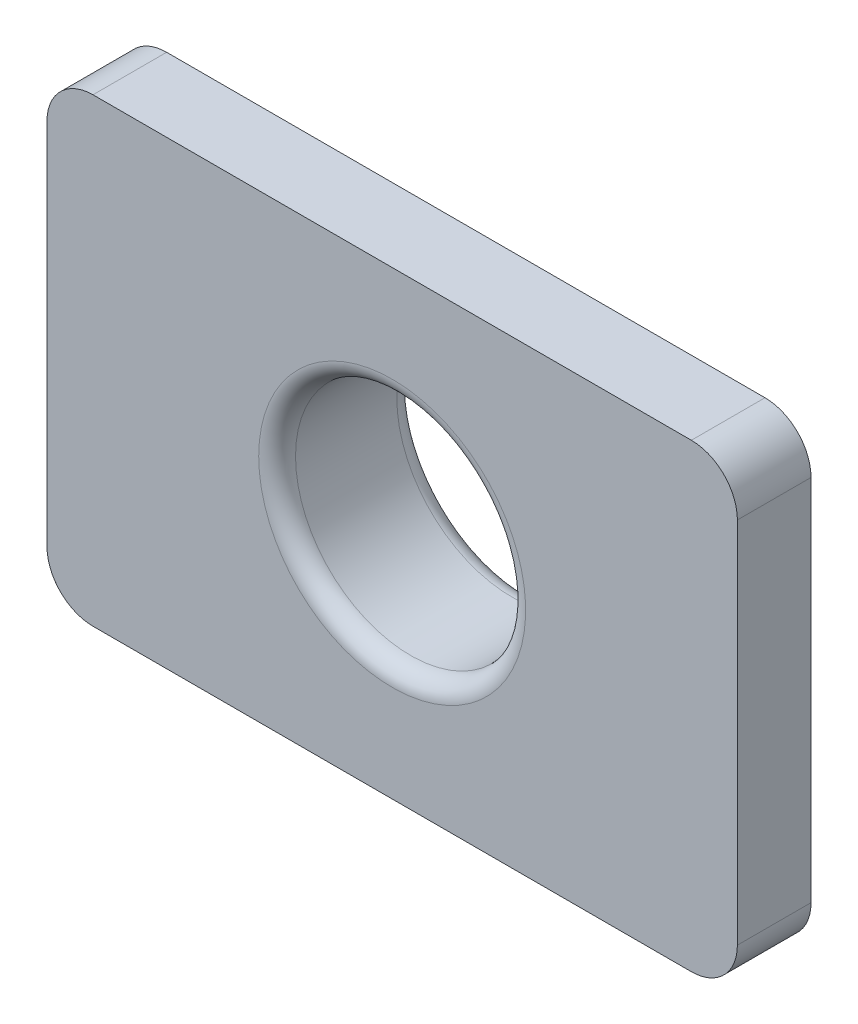
ISO-10303-21;
HEADER;
FILE_DESCRIPTION(('STEP AP214'),'2;1');
FILE_NAME('part.step','',(''),(''),'','','');
FILE_SCHEMA(('AUTOMOTIVE_DESIGN { 1 0 10303 214 1 1 1 1 }'));
ENDSEC;
DATA;
#1=APPLICATION_CONTEXT('core data for automotive mechanical design processes');
#2=APPLICATION_PROTOCOL_DEFINITION('international standard','automotive_design',2000,#1);
#3=PRODUCT_CONTEXT('',#1,'mechanical');
#4=PRODUCT('Part','Part','',(#3));
#5=PRODUCT_RELATED_PRODUCT_CATEGORY('part','',(#4));
#6=PRODUCT_DEFINITION_FORMATION('','',#4);
#7=PRODUCT_DEFINITION_CONTEXT('part definition',#1,'design');
#8=PRODUCT_DEFINITION('design','',#6,#7);
#9=PRODUCT_DEFINITION_SHAPE('','',#8);
#10=(LENGTH_UNIT() NAMED_UNIT(*) SI_UNIT(.MILLI.,.METRE.));
#11=(NAMED_UNIT(*) PLANE_ANGLE_UNIT() SI_UNIT($,.RADIAN.));
#12=(NAMED_UNIT(*) SI_UNIT($,.STERADIAN.) SOLID_ANGLE_UNIT());
#13=UNCERTAINTY_MEASURE_WITH_UNIT(LENGTH_MEASURE(1.E-05),#10,'distance_accuracy_value','');
#14=(GEOMETRIC_REPRESENTATION_CONTEXT(3) GLOBAL_UNCERTAINTY_ASSIGNED_CONTEXT((#13)) GLOBAL_UNIT_ASSIGNED_CONTEXT((#10,
#11,#12)) REPRESENTATION_CONTEXT('',''));
#15=CARTESIAN_POINT('',(0.,0.,0.));
#16=DIRECTION('',(0.,0.,1.));
#17=DIRECTION('',(1.,0.,0.));
#18=AXIS2_PLACEMENT_3D('',#15,#16,#17);
#19=CARTESIAN_POINT('',(0.,0.,0.));
#20=DIRECTION('',(0.,0.,-1.));
#21=DIRECTION('',(-1.,0.,0.));
#22=AXIS2_PLACEMENT_3D('',#19,#20,#21);
#23=PLANE('',#22);
#24=CARTESIAN_POINT('',(7.5,5.,0.));
#25=DIRECTION('',(0.,0.,-1.));
#26=DIRECTION('',(-1.,0.,0.));
#27=AXIS2_PLACEMENT_3D('',#24,#25,#26);
#28=CIRCLE('',#27,3.9);
#29=CARTESIAN_POINT('',(3.6,5.,0.));
#30=VERTEX_POINT('',#29);
#31=EDGE_CURVE('E179',#30,#30,#28,.F.);
#32=ORIENTED_EDGE('',*,*,#31,.T.);
#33=EDGE_LOOP('',(#32));
#34=FACE_BOUND('',#33,.T.);
#35=DIRECTION('',(-1.,0.,0.));
#36=VECTOR('',#35,1.);
#37=CARTESIAN_POINT('',(0.,10.,0.));
#38=LINE('',#37,#36);
#39=CARTESIAN_POINT('',(14.,10.,0.));
#40=VERTEX_POINT('',#39);
#41=CARTESIAN_POINT('',(1.,10.,0.));
#42=VERTEX_POINT('',#41);
#43=EDGE_CURVE('E137',#40,#42,#38,.T.);
#44=ORIENTED_EDGE('',*,*,#43,.F.);
#45=CARTESIAN_POINT('',(14.,9.,0.));
#46=DIRECTION('',(0.,0.,-1.));
#47=DIRECTION('',(-1.,0.,0.));
#48=AXIS2_PLACEMENT_3D('',#45,#46,#47);
#49=CIRCLE('',#48,1.);
#50=CARTESIAN_POINT('',(15.,9.,0.));
#51=VERTEX_POINT('',#50);
#52=EDGE_CURVE('E119',#40,#51,#49,.T.);
#53=ORIENTED_EDGE('',*,*,#52,.T.);
#54=DIRECTION('',(0.,1.,0.));
#55=VECTOR('',#54,1.);
#56=CARTESIAN_POINT('',(15.,0.,0.));
#57=LINE('',#56,#55);
#58=CARTESIAN_POINT('',(15.,1.,0.));
#59=VERTEX_POINT('',#58);
#60=EDGE_CURVE('E149',#59,#51,#57,.T.);
#61=ORIENTED_EDGE('',*,*,#60,.F.);
#62=CARTESIAN_POINT('',(14.,1.,0.));
#63=DIRECTION('',(0.,0.,-1.));
#64=DIRECTION('',(-1.,0.,0.));
#65=AXIS2_PLACEMENT_3D('',#62,#63,#64);
#66=CIRCLE('',#65,1.);
#67=CARTESIAN_POINT('',(14.,0.,0.));
#68=VERTEX_POINT('',#67);
#69=EDGE_CURVE('E131',#59,#68,#66,.T.);
#70=ORIENTED_EDGE('',*,*,#69,.T.);
#71=DIRECTION('',(1.,0.,0.));
#72=VECTOR('',#71,1.);
#73=CARTESIAN_POINT('',(0.,0.,0.));
#74=LINE('',#73,#72);
#75=CARTESIAN_POINT('',(1.,0.,0.));
#76=VERTEX_POINT('',#75);
#77=EDGE_CURVE('E155',#76,#68,#74,.T.);
#78=ORIENTED_EDGE('',*,*,#77,.F.);
#79=CARTESIAN_POINT('',(1.,1.,0.));
#80=DIRECTION('',(0.,0.,-1.));
#81=DIRECTION('',(-1.,0.,0.));
#82=AXIS2_PLACEMENT_3D('',#79,#80,#81);
#83=CIRCLE('',#82,1.);
#84=CARTESIAN_POINT('',(0.,1.,0.));
#85=VERTEX_POINT('',#84);
#86=EDGE_CURVE('E142',#76,#85,#83,.T.);
#87=ORIENTED_EDGE('',*,*,#86,.T.);
#88=DIRECTION('',(0.,-1.,0.));
#89=VECTOR('',#88,1.);
#90=CARTESIAN_POINT('',(0.,0.,0.));
#91=LINE('',#90,#89);
#92=CARTESIAN_POINT('',(0.,9.,0.));
#93=VERTEX_POINT('',#92);
#94=EDGE_CURVE('E226',#93,#85,#91,.T.);
#95=ORIENTED_EDGE('',*,*,#94,.F.);
#96=CARTESIAN_POINT('',(1.,9.,0.));
#97=DIRECTION('',(0.,0.,-1.));
#98=DIRECTION('',(-1.,0.,0.));
#99=AXIS2_PLACEMENT_3D('',#96,#97,#98);
#100=CIRCLE('',#99,1.);
#101=EDGE_CURVE('E146',#93,#42,#100,.T.);
#102=ORIENTED_EDGE('',*,*,#101,.T.);
#103=EDGE_LOOP('',(#44,#53,#61,#70,#78,#87,#95,#102));
#104=FACE_BOUND('',#103,.T.);
#105=ADVANCED_FACE('F38',(#34,#104),#23,.T.);
#106=CARTESIAN_POINT('',(0.,0.,1.6));
#107=DIRECTION('',(0.,0.,-1.));
#108=DIRECTION('',(-1.,0.,0.));
#109=AXIS2_PLACEMENT_3D('',#106,#107,#108);
#110=PLANE('',#109);
#111=CARTESIAN_POINT('',(7.5,5.,1.6));
#112=DIRECTION('',(0.,0.,-1.));
#113=DIRECTION('',(-1.,0.,0.));
#114=AXIS2_PLACEMENT_3D('',#111,#112,#113);
#115=CIRCLE('',#114,2.9);
#116=CARTESIAN_POINT('',(4.6,5.,1.6));
#117=VERTEX_POINT('',#116);
#118=EDGE_CURVE('E167',#117,#117,#115,.T.);
#119=ORIENTED_EDGE('',*,*,#118,.T.);
#120=EDGE_LOOP('',(#119));
#121=FACE_BOUND('',#120,.T.);
#122=DIRECTION('',(0.,1.,0.));
#123=VECTOR('',#122,1.);
#124=CARTESIAN_POINT('',(15.,0.,1.6));
#125=LINE('',#124,#123);
#126=CARTESIAN_POINT('',(15.,1.,1.6));
#127=VERTEX_POINT('',#126);
#128=CARTESIAN_POINT('',(15.,9.,1.6));
#129=VERTEX_POINT('',#128);
#130=EDGE_CURVE('E239',#127,#129,#125,.T.);
#131=ORIENTED_EDGE('',*,*,#130,.T.);
#132=CARTESIAN_POINT('',(14.,9.,1.6));
#133=DIRECTION('',(0.,0.,-1.));
#134=DIRECTION('',(-1.,0.,0.));
#135=AXIS2_PLACEMENT_3D('',#132,#133,#134);
#136=CIRCLE('',#135,1.);
#137=CARTESIAN_POINT('',(14.,10.,1.6));
#138=VERTEX_POINT('',#137);
#139=EDGE_CURVE('E210',#129,#138,#136,.F.);
#140=ORIENTED_EDGE('',*,*,#139,.T.);
#141=DIRECTION('',(-1.,0.,0.));
#142=VECTOR('',#141,1.);
#143=CARTESIAN_POINT('',(0.,10.,1.6));
#144=LINE('',#143,#142);
#145=CARTESIAN_POINT('',(1.,10.,1.6));
#146=VERTEX_POINT('',#145);
#147=EDGE_CURVE('E140',#138,#146,#144,.T.);
#148=ORIENTED_EDGE('',*,*,#147,.T.);
#149=CARTESIAN_POINT('',(1.,9.,1.6));
#150=DIRECTION('',(0.,0.,-1.));
#151=DIRECTION('',(-1.,0.,0.));
#152=AXIS2_PLACEMENT_3D('',#149,#150,#151);
#153=CIRCLE('',#152,1.);
#154=CARTESIAN_POINT('',(0.,9.,1.6));
#155=VERTEX_POINT('',#154);
#156=EDGE_CURVE('E204',#146,#155,#153,.F.);
#157=ORIENTED_EDGE('',*,*,#156,.T.);
#158=DIRECTION('',(0.,-1.,0.));
#159=VECTOR('',#158,1.);
#160=CARTESIAN_POINT('',(0.,0.,1.6));
#161=LINE('',#160,#159);
#162=CARTESIAN_POINT('',(0.,1.,1.6));
#163=VERTEX_POINT('',#162);
#164=EDGE_CURVE('E148',#155,#163,#161,.T.);
#165=ORIENTED_EDGE('',*,*,#164,.T.);
#166=CARTESIAN_POINT('',(1.,1.,1.6));
#167=DIRECTION('',(0.,0.,-1.));
#168=DIRECTION('',(-1.,0.,0.));
#169=AXIS2_PLACEMENT_3D('',#166,#167,#168);
#170=CIRCLE('',#169,1.);
#171=CARTESIAN_POINT('',(1.,0.,1.6));
#172=VERTEX_POINT('',#171);
#173=EDGE_CURVE('E64',#163,#172,#170,.F.);
#174=ORIENTED_EDGE('',*,*,#173,.T.);
#175=DIRECTION('',(1.,0.,0.));
#176=VECTOR('',#175,1.);
#177=CARTESIAN_POINT('',(0.,0.,1.6));
#178=LINE('',#177,#176);
#179=CARTESIAN_POINT('',(14.,0.,1.6));
#180=VERTEX_POINT('',#179);
#181=EDGE_CURVE('E152',#172,#180,#178,.T.);
#182=ORIENTED_EDGE('',*,*,#181,.T.);
#183=CARTESIAN_POINT('',(14.,1.,1.6));
#184=DIRECTION('',(0.,0.,-1.));
#185=DIRECTION('',(-1.,0.,0.));
#186=AXIS2_PLACEMENT_3D('',#183,#184,#185);
#187=CIRCLE('',#186,1.);
#188=EDGE_CURVE('E207',#180,#127,#187,.F.);
#189=ORIENTED_EDGE('',*,*,#188,.T.);
#190=EDGE_LOOP('',(#131,#140,#148,#157,#165,#174,#182,#189));
#191=FACE_BOUND('',#190,.T.);
#192=ADVANCED_FACE('F229',(#121,#191),#110,.F.);
#193=CARTESIAN_POINT('',(0.,0.,1.6));
#194=DIRECTION('',(1.,0.,0.));
#195=DIRECTION('',(0.,0.,-1.));
#196=AXIS2_PLACEMENT_3D('',#193,#194,#195);
#197=PLANE('',#196);
#198=ORIENTED_EDGE('',*,*,#164,.F.);
#199=DIRECTION('',(0.,0.,-1.));
#200=VECTOR('',#199,1.);
#201=CARTESIAN_POINT('',(0.,9.,1.6));
#202=LINE('',#201,#200);
#203=EDGE_CURVE('E11',#155,#93,#202,.T.);
#204=ORIENTED_EDGE('',*,*,#203,.T.);
#205=ORIENTED_EDGE('',*,*,#94,.T.);
#206=DIRECTION('',(0.,0.,-1.));
#207=VECTOR('',#206,1.);
#208=CARTESIAN_POINT('',(0.,1.,1.6));
#209=LINE('',#208,#207);
#210=EDGE_CURVE('E46',#85,#163,#209,.F.);
#211=ORIENTED_EDGE('',*,*,#210,.T.);
#212=EDGE_LOOP('',(#198,#204,#205,#211));
#213=FACE_BOUND('',#212,.T.);
#214=ADVANCED_FACE('F224',(#213),#197,.F.);
#215=CARTESIAN_POINT('',(0.,0.,1.6));
#216=DIRECTION('',(0.,1.,0.));
#217=DIRECTION('',(0.,0.,1.));
#218=AXIS2_PLACEMENT_3D('',#215,#216,#217);
#219=PLANE('',#218);
#220=ORIENTED_EDGE('',*,*,#77,.T.);
#221=DIRECTION('',(0.,0.,-1.));
#222=VECTOR('',#221,1.);
#223=CARTESIAN_POINT('',(14.,0.,1.6));
#224=LINE('',#223,#222);
#225=EDGE_CURVE('E55',#68,#180,#224,.F.);
#226=ORIENTED_EDGE('',*,*,#225,.T.);
#227=ORIENTED_EDGE('',*,*,#181,.F.);
#228=DIRECTION('',(0.,0.,-1.));
#229=VECTOR('',#228,1.);
#230=CARTESIAN_POINT('',(1.,0.,1.6));
#231=LINE('',#230,#229);
#232=EDGE_CURVE('E213',#172,#76,#231,.T.);
#233=ORIENTED_EDGE('',*,*,#232,.T.);
#234=EDGE_LOOP('',(#220,#226,#227,#233));
#235=FACE_BOUND('',#234,.T.);
#236=ADVANCED_FACE('F233',(#235),#219,.F.);
#237=CARTESIAN_POINT('',(15.,0.,1.6));
#238=DIRECTION('',(-1.,0.,0.));
#239=DIRECTION('',(0.,0.,1.));
#240=AXIS2_PLACEMENT_3D('',#237,#238,#239);
#241=PLANE('',#240);
#242=ORIENTED_EDGE('',*,*,#60,.T.);
#243=DIRECTION('',(0.,0.,-1.));
#244=VECTOR('',#243,1.);
#245=CARTESIAN_POINT('',(15.,9.,1.6));
#246=LINE('',#245,#244);
#247=EDGE_CURVE('E124',#51,#129,#246,.F.);
#248=ORIENTED_EDGE('',*,*,#247,.T.);
#249=ORIENTED_EDGE('',*,*,#130,.F.);
#250=DIRECTION('',(0.,0.,-1.));
#251=VECTOR('',#250,1.);
#252=CARTESIAN_POINT('',(15.,1.,1.6));
#253=LINE('',#252,#251);
#254=EDGE_CURVE('E130',#127,#59,#253,.T.);
#255=ORIENTED_EDGE('',*,*,#254,.T.);
#256=EDGE_LOOP('',(#242,#248,#249,#255));
#257=FACE_BOUND('',#256,.T.);
#258=ADVANCED_FACE('F249',(#257),#241,.F.);
#259=CARTESIAN_POINT('',(0.,10.,1.6));
#260=DIRECTION('',(0.,-1.,0.));
#261=DIRECTION('',(0.,0.,-1.));
#262=AXIS2_PLACEMENT_3D('',#259,#260,#261);
#263=PLANE('',#262);
#264=ORIENTED_EDGE('',*,*,#147,.F.);
#265=DIRECTION('',(0.,0.,-1.));
#266=VECTOR('',#265,1.);
#267=CARTESIAN_POINT('',(14.,10.,1.6));
#268=LINE('',#267,#266);
#269=EDGE_CURVE('E123',#138,#40,#268,.T.);
#270=ORIENTED_EDGE('',*,*,#269,.T.);
#271=ORIENTED_EDGE('',*,*,#43,.T.);
#272=DIRECTION('',(0.,0.,-1.));
#273=VECTOR('',#272,1.);
#274=CARTESIAN_POINT('',(1.,10.,1.6));
#275=LINE('',#274,#273);
#276=EDGE_CURVE('E143',#42,#146,#275,.F.);
#277=ORIENTED_EDGE('',*,*,#276,.T.);
#278=EDGE_LOOP('',(#264,#270,#271,#277));
#279=FACE_BOUND('',#278,.T.);
#280=ADVANCED_FACE('F136',(#279),#263,.F.);
#281=CARTESIAN_POINT('',(7.5,5.,1.6));
#282=DIRECTION('',(0.,0.,-1.));
#283=DIRECTION('',(-1.,0.,0.));
#284=AXIS2_PLACEMENT_3D('',#281,#282,#283);
#285=CYLINDRICAL_SURFACE('',#284,2.5);
#286=CARTESIAN_POINT('',(7.5,5.,1.2));
#287=DIRECTION('',(0.,0.,-1.));
#288=DIRECTION('',(-1.,0.,0.));
#289=AXIS2_PLACEMENT_3D('',#286,#287,#288);
#290=CIRCLE('',#289,2.5);
#291=CARTESIAN_POINT('',(5.,5.,1.2));
#292=VERTEX_POINT('',#291);
#293=EDGE_CURVE('E163',#292,#292,#290,.F.);
#294=ORIENTED_EDGE('',*,*,#293,.T.);
#295=EDGE_LOOP('',(#294));
#296=FACE_BOUND('',#295,.T.);
#297=CARTESIAN_POINT('',(7.5,5.,-1.));
#298=DIRECTION('',(0.,0.,-1.));
#299=DIRECTION('',(-1.,0.,0.));
#300=AXIS2_PLACEMENT_3D('',#297,#298,#299);
#301=CIRCLE('',#300,2.5);
#302=CARTESIAN_POINT('',(5.,5.,-1.));
#303=VERTEX_POINT('',#302);
#304=EDGE_CURVE('E159',#303,#303,#301,.T.);
#305=ORIENTED_EDGE('',*,*,#304,.T.);
#306=EDGE_LOOP('',(#305));
#307=FACE_BOUND('',#306,.T.);
#308=ADVANCED_FACE('F270',(#296,#307),#285,.F.);
#309=CARTESIAN_POINT('',(7.5,5.,-1.4));
#310=DIRECTION('',(0.,0.,-1.));
#311=DIRECTION('',(-1.,0.,0.));
#312=AXIS2_PLACEMENT_3D('',#309,#310,#311);
#313=PLANE('',#312);
#314=CARTESIAN_POINT('',(7.5,5.,-1.4));
#315=DIRECTION('',(0.,0.,-1.));
#316=DIRECTION('',(-1.,0.,0.));
#317=AXIS2_PLACEMENT_3D('',#314,#315,#316);
#318=CIRCLE('',#317,3.1);
#319=CARTESIAN_POINT('',(4.4,5.,-1.4));
#320=VERTEX_POINT('',#319);
#321=EDGE_CURVE('E187',#320,#320,#318,.T.);
#322=ORIENTED_EDGE('',*,*,#321,.T.);
#323=EDGE_LOOP('',(#322));
#324=FACE_BOUND('',#323,.T.);
#325=CARTESIAN_POINT('',(7.5,5.,-1.4));
#326=DIRECTION('',(0.,0.,-1.));
#327=DIRECTION('',(-1.,0.,0.));
#328=AXIS2_PLACEMENT_3D('',#325,#326,#327);
#329=CIRCLE('',#328,2.9);
#330=CARTESIAN_POINT('',(4.6,5.,-1.4));
#331=VERTEX_POINT('',#330);
#332=EDGE_CURVE('E183',#331,#331,#329,.F.);
#333=ORIENTED_EDGE('',*,*,#332,.T.);
#334=EDGE_LOOP('',(#333));
#335=FACE_BOUND('',#334,.T.);
#336=ADVANCED_FACE('F345',(#324,#335),#313,.T.);
#337=CARTESIAN_POINT('',(7.5,5.,-1.4));
#338=DIRECTION('',(0.,0.,1.));
#339=DIRECTION('',(1.,0.,0.));
#340=AXIS2_PLACEMENT_3D('',#337,#338,#339);
#341=CYLINDRICAL_SURFACE('',#340,3.5);
#342=CARTESIAN_POINT('',(7.5,5.,-0.4));
#343=DIRECTION('',(0.,0.,-1.));
#344=DIRECTION('',(-1.,0.,0.));
#345=AXIS2_PLACEMENT_3D('',#342,#343,#344);
#346=CIRCLE('',#345,3.5);
#347=CARTESIAN_POINT('',(4.,5.,-0.4));
#348=VERTEX_POINT('',#347);
#349=EDGE_CURVE('E175',#348,#348,#346,.T.);
#350=ORIENTED_EDGE('',*,*,#349,.T.);
#351=EDGE_LOOP('',(#350));
#352=FACE_BOUND('',#351,.T.);
#353=CARTESIAN_POINT('',(7.5,5.,-1.));
#354=DIRECTION('',(0.,0.,-1.));
#355=DIRECTION('',(-1.,0.,0.));
#356=AXIS2_PLACEMENT_3D('',#353,#354,#355);
#357=CIRCLE('',#356,3.5);
#358=CARTESIAN_POINT('',(4.,5.,-1.));
#359=VERTEX_POINT('',#358);
#360=EDGE_CURVE('E171',#359,#359,#357,.F.);
#361=ORIENTED_EDGE('',*,*,#360,.T.);
#362=EDGE_LOOP('',(#361));
#363=FACE_BOUND('',#362,.T.);
#364=ADVANCED_FACE('F281',(#352,#363),#341,.T.);
#365=CARTESIAN_POINT('',(7.5,5.,1.2));
#366=DIRECTION('',(0.,0.,-1.));
#367=DIRECTION('',(-1.,0.,0.));
#368=AXIS2_PLACEMENT_3D('',#365,#366,#367);
#369=TOROIDAL_SURFACE('',#368,2.9,0.4);
#370=ORIENTED_EDGE('',*,*,#118,.F.);
#371=EDGE_LOOP('',(#370));
#372=FACE_BOUND('',#371,.T.);
#373=ORIENTED_EDGE('',*,*,#293,.F.);
#374=EDGE_LOOP('',(#373));
#375=FACE_BOUND('',#374,.T.);
#376=ADVANCED_FACE('F277',(#372,#375),#369,.T.);
#377=CARTESIAN_POINT('',(7.5,5.,-0.4));
#378=DIRECTION('',(0.,0.,-1.));
#379=DIRECTION('',(-1.,0.,0.));
#380=AXIS2_PLACEMENT_3D('',#377,#378,#379);
#381=TOROIDAL_SURFACE('',#380,3.9,0.4);
#382=ORIENTED_EDGE('',*,*,#31,.F.);
#383=EDGE_LOOP('',(#382));
#384=FACE_BOUND('',#383,.T.);
#385=ORIENTED_EDGE('',*,*,#349,.F.);
#386=EDGE_LOOP('',(#385));
#387=FACE_BOUND('',#386,.T.);
#388=ADVANCED_FACE('F280',(#384,#387),#381,.F.);
#389=CARTESIAN_POINT('',(7.5,5.,-1.));
#390=DIRECTION('',(0.,0.,-1.));
#391=DIRECTION('',(-1.,0.,0.));
#392=AXIS2_PLACEMENT_3D('',#389,#390,#391);
#393=TOROIDAL_SURFACE('',#392,3.1,0.4);
#394=ORIENTED_EDGE('',*,*,#360,.F.);
#395=EDGE_LOOP('',(#394));
#396=FACE_BOUND('',#395,.T.);
#397=ORIENTED_EDGE('',*,*,#321,.F.);
#398=EDGE_LOOP('',(#397));
#399=FACE_BOUND('',#398,.T.);
#400=ADVANCED_FACE('F285',(#396,#399),#393,.T.);
#401=CARTESIAN_POINT('',(7.5,5.,-1.));
#402=DIRECTION('',(0.,0.,-1.));
#403=DIRECTION('',(-1.,0.,0.));
#404=AXIS2_PLACEMENT_3D('',#401,#402,#403);
#405=TOROIDAL_SURFACE('',#404,2.9,0.4);
#406=ORIENTED_EDGE('',*,*,#332,.F.);
#407=EDGE_LOOP('',(#406));
#408=FACE_BOUND('',#407,.T.);
#409=ORIENTED_EDGE('',*,*,#304,.F.);
#410=EDGE_LOOP('',(#409));
#411=FACE_BOUND('',#410,.T.);
#412=ADVANCED_FACE('F289',(#408,#411),#405,.T.);
#413=CARTESIAN_POINT('',(14.,9.,1.6));
#414=DIRECTION('',(0.,0.,-1.));
#415=DIRECTION('',(-1.,0.,0.));
#416=AXIS2_PLACEMENT_3D('',#413,#414,#415);
#417=CYLINDRICAL_SURFACE('',#416,1.);
#418=ORIENTED_EDGE('',*,*,#139,.F.);
#419=ORIENTED_EDGE('',*,*,#247,.F.);
#420=ORIENTED_EDGE('',*,*,#52,.F.);
#421=ORIENTED_EDGE('',*,*,#269,.F.);
#422=EDGE_LOOP('',(#418,#419,#420,#421));
#423=FACE_BOUND('',#422,.T.);
#424=ADVANCED_FACE('F122',(#423),#417,.T.);
#425=CARTESIAN_POINT('',(14.,1.,1.6));
#426=DIRECTION('',(0.,0.,-1.));
#427=DIRECTION('',(-1.,0.,0.));
#428=AXIS2_PLACEMENT_3D('',#425,#426,#427);
#429=CYLINDRICAL_SURFACE('',#428,1.);
#430=ORIENTED_EDGE('',*,*,#188,.F.);
#431=ORIENTED_EDGE('',*,*,#225,.F.);
#432=ORIENTED_EDGE('',*,*,#69,.F.);
#433=ORIENTED_EDGE('',*,*,#254,.F.);
#434=EDGE_LOOP('',(#430,#431,#432,#433));
#435=FACE_BOUND('',#434,.T.);
#436=ADVANCED_FACE('F247',(#435),#429,.T.);
#437=CARTESIAN_POINT('',(1.,9.,1.6));
#438=DIRECTION('',(0.,0.,-1.));
#439=DIRECTION('',(-1.,0.,0.));
#440=AXIS2_PLACEMENT_3D('',#437,#438,#439);
#441=CYLINDRICAL_SURFACE('',#440,1.);
#442=ORIENTED_EDGE('',*,*,#156,.F.);
#443=ORIENTED_EDGE('',*,*,#276,.F.);
#444=ORIENTED_EDGE('',*,*,#101,.F.);
#445=ORIENTED_EDGE('',*,*,#203,.F.);
#446=EDGE_LOOP('',(#442,#443,#444,#445));
#447=FACE_BOUND('',#446,.T.);
#448=ADVANCED_FACE('F251',(#447),#441,.T.);
#449=CARTESIAN_POINT('',(1.,1.,1.6));
#450=DIRECTION('',(0.,0.,-1.));
#451=DIRECTION('',(-1.,0.,0.));
#452=AXIS2_PLACEMENT_3D('',#449,#450,#451);
#453=CYLINDRICAL_SURFACE('',#452,1.);
#454=ORIENTED_EDGE('',*,*,#173,.F.);
#455=ORIENTED_EDGE('',*,*,#210,.F.);
#456=ORIENTED_EDGE('',*,*,#86,.F.);
#457=ORIENTED_EDGE('',*,*,#232,.F.);
#458=EDGE_LOOP('',(#454,#455,#456,#457));
#459=FACE_BOUND('',#458,.T.);
#460=ADVANCED_FACE('F40',(#459),#453,.T.);
#461=CLOSED_SHELL('',(#105,#192,#214,#236,#258,#280,#308,#336,#364,#376,#388,#400,#412,#424,
#436,#448,#460));
#462=MANIFOLD_SOLID_BREP('B2',#461);
#463=ADVANCED_BREP_SHAPE_REPRESENTATION('',(#18,#462),#14);
#464=SHAPE_DEFINITION_REPRESENTATION(#9,#463);
ENDSEC;
END-ISO-10303-21;
